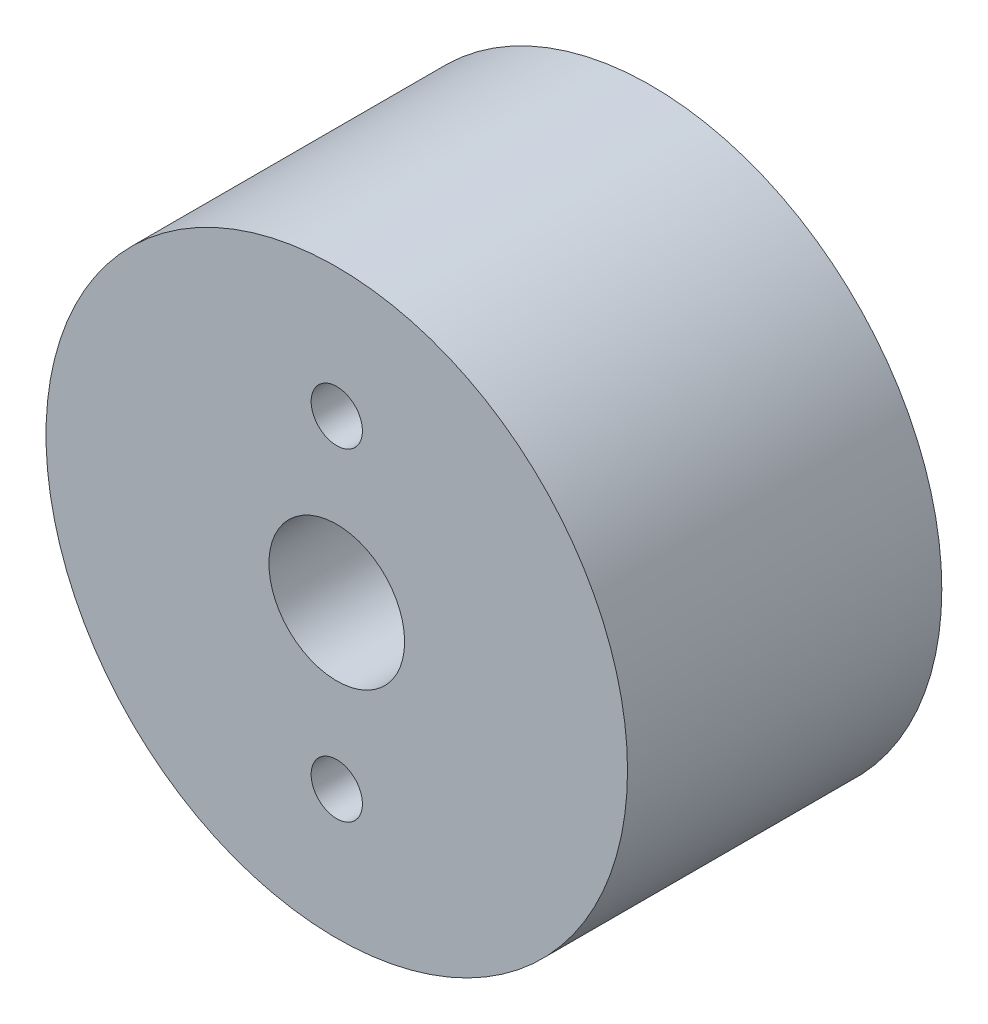
ISO-10303-21;
HEADER;
FILE_DESCRIPTION(('STEP AP214'),'2;1');
FILE_NAME('part.step','',(''),(''),'','','');
FILE_SCHEMA(('AUTOMOTIVE_DESIGN { 1 0 10303 214 1 1 1 1 }'));
ENDSEC;
DATA;
#1=APPLICATION_CONTEXT('core data for automotive mechanical design processes');
#2=APPLICATION_PROTOCOL_DEFINITION('international standard','automotive_design',2000,#1);
#3=PRODUCT_CONTEXT('',#1,'mechanical');
#4=PRODUCT('Part','Part','',(#3));
#5=PRODUCT_RELATED_PRODUCT_CATEGORY('part','',(#4));
#6=PRODUCT_DEFINITION_FORMATION('','',#4);
#7=PRODUCT_DEFINITION_CONTEXT('part definition',#1,'design');
#8=PRODUCT_DEFINITION('design','',#6,#7);
#9=PRODUCT_DEFINITION_SHAPE('','',#8);
#10=(LENGTH_UNIT() NAMED_UNIT(*) SI_UNIT(.MILLI.,.METRE.));
#11=(NAMED_UNIT(*) PLANE_ANGLE_UNIT() SI_UNIT($,.RADIAN.));
#12=(NAMED_UNIT(*) SI_UNIT($,.STERADIAN.) SOLID_ANGLE_UNIT());
#13=UNCERTAINTY_MEASURE_WITH_UNIT(LENGTH_MEASURE(1.E-05),#10,'distance_accuracy_value','');
#14=(GEOMETRIC_REPRESENTATION_CONTEXT(3) GLOBAL_UNCERTAINTY_ASSIGNED_CONTEXT((#13)) GLOBAL_UNIT_ASSIGNED_CONTEXT((#10,
#11,#12)) REPRESENTATION_CONTEXT('',''));
#15=CARTESIAN_POINT('',(0.,0.,0.));
#16=DIRECTION('',(0.,0.,1.));
#17=DIRECTION('',(1.,0.,0.));
#18=AXIS2_PLACEMENT_3D('',#15,#16,#17);
#19=CARTESIAN_POINT('',(0.,0.,19.4564));
#20=DIRECTION('',(0.,0.,1.));
#21=DIRECTION('',(1.,0.,0.));
#22=AXIS2_PLACEMENT_3D('',#19,#20,#21);
#23=PLANE('',#22);
#24=CARTESIAN_POINT('',(0.,0.,19.4564));
#25=DIRECTION('',(0.,0.,1.));
#26=DIRECTION('',(1.,0.,0.));
#27=AXIS2_PLACEMENT_3D('',#24,#25,#26);
#28=CIRCLE('',#27,4.2);
#29=CARTESIAN_POINT('',(4.2,0.,19.4564));
#30=VERTEX_POINT('',#29);
#31=EDGE_CURVE('E47',#30,#30,#28,.T.);
#32=ORIENTED_EDGE('',*,*,#31,.F.);
#33=EDGE_LOOP('',(#32));
#34=FACE_BOUND('',#33,.T.);
#35=CARTESIAN_POINT('',(0.,0.,19.4564));
#36=DIRECTION('',(0.,0.,1.));
#37=DIRECTION('',(1.,0.,0.));
#38=AXIS2_PLACEMENT_3D('',#35,#36,#37);
#39=CIRCLE('',#38,18.);
#40=CARTESIAN_POINT('',(18.,0.,19.4564));
#41=VERTEX_POINT('',#40);
#42=EDGE_CURVE('E10',#41,#41,#39,.T.);
#43=ORIENTED_EDGE('',*,*,#42,.T.);
#44=EDGE_LOOP('',(#43));
#45=FACE_BOUND('',#44,.T.);
#46=CARTESIAN_POINT('',(0.,10.,19.4564));
#47=DIRECTION('',(0.,0.,1.));
#48=DIRECTION('',(1.,0.,0.));
#49=AXIS2_PLACEMENT_3D('',#46,#47,#48);
#50=CIRCLE('',#49,1.5875);
#51=CARTESIAN_POINT('',(1.5875,10.,19.4564));
#52=VERTEX_POINT('',#51);
#53=EDGE_CURVE('E42',#52,#52,#50,.T.);
#54=ORIENTED_EDGE('',*,*,#53,.F.);
#55=EDGE_LOOP('',(#54));
#56=FACE_BOUND('',#55,.T.);
#57=CARTESIAN_POINT('',(2.8176792204172E-13,-10.,19.4564));
#58=DIRECTION('',(0.,0.,1.));
#59=DIRECTION('',(1.,0.,0.));
#60=AXIS2_PLACEMENT_3D('',#57,#58,#59);
#61=CIRCLE('',#60,1.5875);
#62=CARTESIAN_POINT('',(1.58750000000028,-10.,19.4564));
#63=VERTEX_POINT('',#62);
#64=EDGE_CURVE('E53',#63,#63,#61,.T.);
#65=ORIENTED_EDGE('',*,*,#64,.F.);
#66=EDGE_LOOP('',(#65));
#67=FACE_BOUND('',#66,.T.);
#68=ADVANCED_FACE('F31',(#34,#45,#56,#67),#23,.T.);
#69=CARTESIAN_POINT('',(0.,0.,0.));
#70=DIRECTION('',(0.,0.,1.));
#71=DIRECTION('',(1.,0.,0.));
#72=AXIS2_PLACEMENT_3D('',#69,#70,#71);
#73=PLANE('',#72);
#74=CARTESIAN_POINT('',(0.,0.,0.));
#75=DIRECTION('',(0.,0.,1.));
#76=DIRECTION('',(1.,0.,0.));
#77=AXIS2_PLACEMENT_3D('',#74,#75,#76);
#78=CIRCLE('',#77,4.2);
#79=CARTESIAN_POINT('',(4.2,0.,0.));
#80=VERTEX_POINT('',#79);
#81=EDGE_CURVE('E50',#80,#80,#78,.T.);
#82=ORIENTED_EDGE('',*,*,#81,.T.);
#83=EDGE_LOOP('',(#82));
#84=FACE_BOUND('',#83,.T.);
#85=CARTESIAN_POINT('',(0.,0.,0.));
#86=DIRECTION('',(0.,0.,1.));
#87=DIRECTION('',(1.,0.,0.));
#88=AXIS2_PLACEMENT_3D('',#85,#86,#87);
#89=CIRCLE('',#88,18.);
#90=CARTESIAN_POINT('',(18.,0.,0.));
#91=VERTEX_POINT('',#90);
#92=EDGE_CURVE('E35',#91,#91,#89,.T.);
#93=ORIENTED_EDGE('',*,*,#92,.F.);
#94=EDGE_LOOP('',(#93));
#95=FACE_BOUND('',#94,.T.);
#96=CARTESIAN_POINT('',(0.,10.,0.));
#97=DIRECTION('',(0.,0.,1.));
#98=DIRECTION('',(1.,0.,0.));
#99=AXIS2_PLACEMENT_3D('',#96,#97,#98);
#100=CIRCLE('',#99,1.5875);
#101=CARTESIAN_POINT('',(1.5875,10.,0.));
#102=VERTEX_POINT('',#101);
#103=EDGE_CURVE('E44',#102,#102,#100,.T.);
#104=ORIENTED_EDGE('',*,*,#103,.T.);
#105=EDGE_LOOP('',(#104));
#106=FACE_BOUND('',#105,.T.);
#107=CARTESIAN_POINT('',(2.8176792204172E-13,-10.,0.));
#108=DIRECTION('',(0.,0.,1.));
#109=DIRECTION('',(1.,0.,0.));
#110=AXIS2_PLACEMENT_3D('',#107,#108,#109);
#111=CIRCLE('',#110,1.5875);
#112=CARTESIAN_POINT('',(1.58750000000028,-10.,0.));
#113=VERTEX_POINT('',#112);
#114=EDGE_CURVE('E56',#113,#113,#111,.T.);
#115=ORIENTED_EDGE('',*,*,#114,.T.);
#116=EDGE_LOOP('',(#115));
#117=FACE_BOUND('',#116,.T.);
#118=ADVANCED_FACE('F66',(#84,#95,#106,#117),#73,.F.);
#119=CARTESIAN_POINT('',(0.,0.,19.4564));
#120=DIRECTION('',(0.,0.,-1.));
#121=DIRECTION('',(-1.,0.,0.));
#122=AXIS2_PLACEMENT_3D('',#119,#120,#121);
#123=CYLINDRICAL_SURFACE('',#122,18.);
#124=ORIENTED_EDGE('',*,*,#42,.F.);
#125=EDGE_LOOP('',(#124));
#126=FACE_BOUND('',#125,.T.);
#127=ORIENTED_EDGE('',*,*,#92,.T.);
#128=EDGE_LOOP('',(#127));
#129=FACE_BOUND('',#128,.T.);
#130=ADVANCED_FACE('F33',(#126,#129),#123,.T.);
#131=CARTESIAN_POINT('',(0.,10.,19.4564));
#132=DIRECTION('',(0.,0.,-1.));
#133=DIRECTION('',(-1.,0.,0.));
#134=AXIS2_PLACEMENT_3D('',#131,#132,#133);
#135=CYLINDRICAL_SURFACE('',#134,1.5875);
#136=ORIENTED_EDGE('',*,*,#53,.T.);
#137=EDGE_LOOP('',(#136));
#138=FACE_BOUND('',#137,.T.);
#139=ORIENTED_EDGE('',*,*,#103,.F.);
#140=EDGE_LOOP('',(#139));
#141=FACE_BOUND('',#140,.T.);
#142=ADVANCED_FACE('F75',(#138,#141),#135,.F.);
#143=CARTESIAN_POINT('',(0.,0.,19.4564));
#144=DIRECTION('',(0.,0.,-1.));
#145=DIRECTION('',(-1.,0.,0.));
#146=AXIS2_PLACEMENT_3D('',#143,#144,#145);
#147=CYLINDRICAL_SURFACE('',#146,4.2);
#148=ORIENTED_EDGE('',*,*,#31,.T.);
#149=EDGE_LOOP('',(#148));
#150=FACE_BOUND('',#149,.T.);
#151=ORIENTED_EDGE('',*,*,#81,.F.);
#152=EDGE_LOOP('',(#151));
#153=FACE_BOUND('',#152,.T.);
#154=ADVANCED_FACE('F78',(#150,#153),#147,.F.);
#155=CARTESIAN_POINT('',(2.8176792204172E-13,-10.,19.4564));
#156=DIRECTION('',(0.,0.,-1.));
#157=DIRECTION('',(-1.,0.,0.));
#158=AXIS2_PLACEMENT_3D('',#155,#156,#157);
#159=CYLINDRICAL_SURFACE('',#158,1.5875);
#160=ORIENTED_EDGE('',*,*,#64,.T.);
#161=EDGE_LOOP('',(#160));
#162=FACE_BOUND('',#161,.T.);
#163=ORIENTED_EDGE('',*,*,#114,.F.);
#164=EDGE_LOOP('',(#163));
#165=FACE_BOUND('',#164,.T.);
#166=ADVANCED_FACE('F62',(#162,#165),#159,.F.);
#167=CLOSED_SHELL('',(#68,#118,#130,#142,#154,#166));
#168=MANIFOLD_SOLID_BREP('B2',#167);
#169=ADVANCED_BREP_SHAPE_REPRESENTATION('',(#18,#168),#14);
#170=SHAPE_DEFINITION_REPRESENTATION(#9,#169);
ENDSEC;
END-ISO-10303-21;
